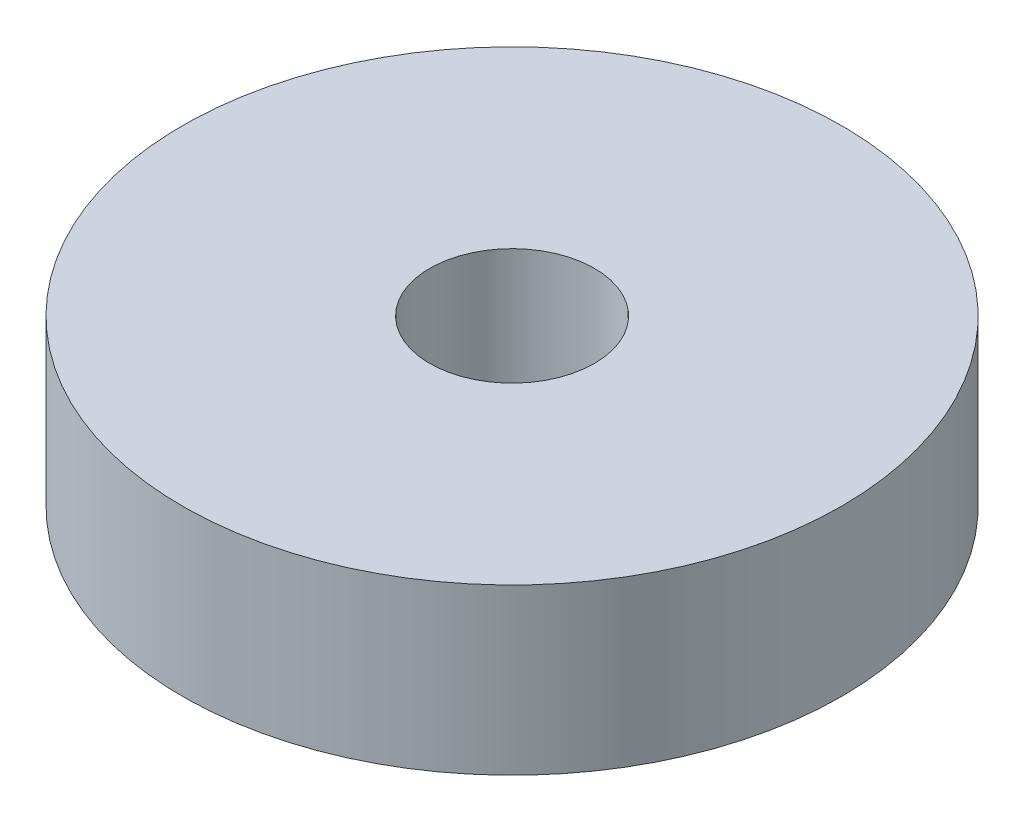
ISO-10303-21;
HEADER;
FILE_DESCRIPTION(('STEP AP214'),'2;1');
FILE_NAME('part.step','',(''),(''),'','','');
FILE_SCHEMA(('AUTOMOTIVE_DESIGN { 1 0 10303 214 1 1 1 1 }'));
ENDSEC;
DATA;
#1=APPLICATION_CONTEXT('core data for automotive mechanical design processes');
#2=APPLICATION_PROTOCOL_DEFINITION('international standard','automotive_design',2000,#1);
#3=PRODUCT_CONTEXT('',#1,'mechanical');
#4=PRODUCT('Part','Part','',(#3));
#5=PRODUCT_RELATED_PRODUCT_CATEGORY('part','',(#4));
#6=PRODUCT_DEFINITION_FORMATION('','',#4);
#7=PRODUCT_DEFINITION_CONTEXT('part definition',#1,'design');
#8=PRODUCT_DEFINITION('design','',#6,#7);
#9=PRODUCT_DEFINITION_SHAPE('','',#8);
#10=(LENGTH_UNIT() NAMED_UNIT(*) SI_UNIT(.MILLI.,.METRE.));
#11=(NAMED_UNIT(*) PLANE_ANGLE_UNIT() SI_UNIT($,.RADIAN.));
#12=(NAMED_UNIT(*) SI_UNIT($,.STERADIAN.) SOLID_ANGLE_UNIT());
#13=UNCERTAINTY_MEASURE_WITH_UNIT(LENGTH_MEASURE(1.E-05),#10,'distance_accuracy_value','');
#14=(GEOMETRIC_REPRESENTATION_CONTEXT(3) GLOBAL_UNCERTAINTY_ASSIGNED_CONTEXT((#13)) GLOBAL_UNIT_ASSIGNED_CONTEXT((#10,
#11,#12)) REPRESENTATION_CONTEXT('',''));
#15=CARTESIAN_POINT('',(0.,0.,0.));
#16=DIRECTION('',(0.,0.,1.));
#17=DIRECTION('',(1.,0.,0.));
#18=AXIS2_PLACEMENT_3D('',#15,#16,#17);
#19=CARTESIAN_POINT('',(1.5,1.49999999999999,0.));
#20=DIRECTION('',(0.,1.,0.));
#21=DIRECTION('',(-1.,0.,0.));
#22=AXIS2_PLACEMENT_3D('',#19,#20,#21);
#23=PLANE('',#22);
#24=CARTESIAN_POINT('',(0.,1.5,0.));
#25=DIRECTION('',(0.,-1.,0.));
#26=DIRECTION('',(1.,0.,0.));
#27=AXIS2_PLACEMENT_3D('',#24,#25,#26);
#28=CIRCLE('',#27,1.50000000000001);
#29=CARTESIAN_POINT('',(1.5,1.50000000000001,0.));
#30=VERTEX_POINT('',#29);
#31=EDGE_CURVE('E60',#30,#30,#28,.T.);
#32=ORIENTED_EDGE('',*,*,#31,.T.);
#33=EDGE_LOOP('',(#32));
#34=FACE_BOUND('',#33,.T.);
#35=CARTESIAN_POINT('',(0.,1.49999999999999,0.));
#36=DIRECTION('',(0.,-1.,0.));
#37=DIRECTION('',(1.,0.,0.));
#38=AXIS2_PLACEMENT_3D('',#35,#36,#37);
#39=CIRCLE('',#38,6.00000000000001);
#40=CARTESIAN_POINT('',(6.,1.50000000000001,0.));
#41=VERTEX_POINT('',#40);
#42=EDGE_CURVE('E10',#41,#41,#39,.T.);
#43=ORIENTED_EDGE('',*,*,#42,.F.);
#44=EDGE_LOOP('',(#43));
#45=FACE_BOUND('',#44,.T.);
#46=ADVANCED_FACE('F43',(#34,#45),#23,.T.);
#47=CARTESIAN_POINT('',(3.78368562958723E-13,-110.303526968925,0.));
#48=DIRECTION('',(0.,-1.,0.));
#49=DIRECTION('',(1.,0.,0.));
#50=AXIS2_PLACEMENT_3D('',#47,#48,#49);
#51=CYLINDRICAL_SURFACE('',#50,6.);
#52=ORIENTED_EDGE('',*,*,#42,.T.);
#53=EDGE_LOOP('',(#52));
#54=FACE_BOUND('',#53,.T.);
#55=CARTESIAN_POINT('',(0.,-1.50000000000002,0.));
#56=DIRECTION('',(0.,-1.,0.));
#57=DIRECTION('',(1.,0.,0.));
#58=AXIS2_PLACEMENT_3D('',#55,#56,#57);
#59=CIRCLE('',#58,5.99999999999999);
#60=CARTESIAN_POINT('',(6.,-1.49999999999999,0.));
#61=VERTEX_POINT('',#60);
#62=EDGE_CURVE('E50',#61,#61,#59,.T.);
#63=ORIENTED_EDGE('',*,*,#62,.F.);
#64=EDGE_LOOP('',(#63));
#65=FACE_BOUND('',#64,.T.);
#66=ADVANCED_FACE('F77',(#54,#65),#51,.T.);
#67=CARTESIAN_POINT('',(1.5,-1.50000000000001,0.));
#68=DIRECTION('',(0.,-1.,0.));
#69=DIRECTION('',(1.,0.,0.));
#70=AXIS2_PLACEMENT_3D('',#67,#68,#69);
#71=PLANE('',#70);
#72=ORIENTED_EDGE('',*,*,#62,.T.);
#73=EDGE_LOOP('',(#72));
#74=FACE_BOUND('',#73,.T.);
#75=CARTESIAN_POINT('',(0.,-1.5,0.));
#76=DIRECTION('',(0.,-1.,0.));
#77=DIRECTION('',(1.,0.,0.));
#78=AXIS2_PLACEMENT_3D('',#75,#76,#77);
#79=CIRCLE('',#78,1.5);
#80=CARTESIAN_POINT('',(1.5,-1.5,0.));
#81=VERTEX_POINT('',#80);
#82=EDGE_CURVE('E55',#81,#81,#79,.T.);
#83=ORIENTED_EDGE('',*,*,#82,.F.);
#84=EDGE_LOOP('',(#83));
#85=FACE_BOUND('',#84,.T.);
#86=ADVANCED_FACE('F71',(#74,#85),#71,.T.);
#87=CARTESIAN_POINT('',(3.78368562958723E-13,-110.303526968925,0.));
#88=DIRECTION('',(0.,-1.,0.));
#89=DIRECTION('',(1.,0.,0.));
#90=AXIS2_PLACEMENT_3D('',#87,#88,#89);
#91=CYLINDRICAL_SURFACE('',#90,1.5);
#92=ORIENTED_EDGE('',*,*,#82,.T.);
#93=EDGE_LOOP('',(#92));
#94=FACE_BOUND('',#93,.T.);
#95=ORIENTED_EDGE('',*,*,#31,.F.);
#96=EDGE_LOOP('',(#95));
#97=FACE_BOUND('',#96,.T.);
#98=ADVANCED_FACE('F69',(#94,#97),#91,.F.);
#99=CLOSED_SHELL('',(#46,#66,#86,#98));
#100=MANIFOLD_SOLID_BREP('B2',#99);
#101=ADVANCED_BREP_SHAPE_REPRESENTATION('',(#18,#100),#14);
#102=SHAPE_DEFINITION_REPRESENTATION(#9,#101);
ENDSEC;
END-ISO-10303-21;
